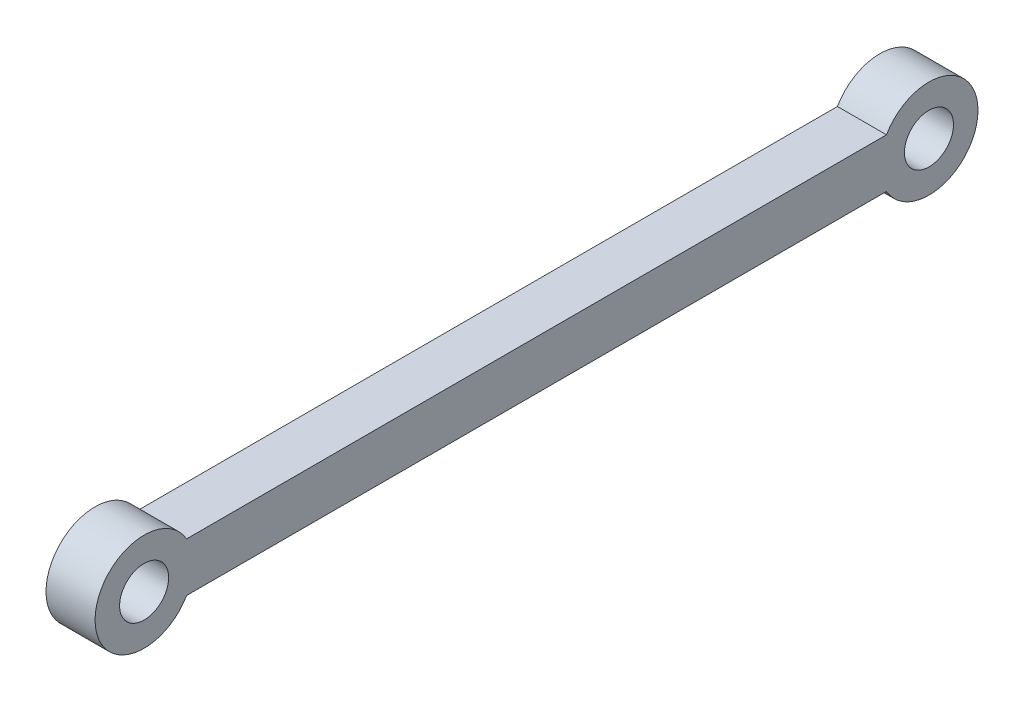
ISO-10303-21;
HEADER;
FILE_DESCRIPTION(('STEP AP214'),'2;1');
FILE_NAME('part.step','',(''),(''),'','','');
FILE_SCHEMA(('AUTOMOTIVE_DESIGN { 1 0 10303 214 1 1 1 1 }'));
ENDSEC;
DATA;
#1=APPLICATION_CONTEXT('core data for automotive mechanical design processes');
#2=APPLICATION_PROTOCOL_DEFINITION('international standard','automotive_design',2000,#1);
#3=PRODUCT_CONTEXT('',#1,'mechanical');
#4=PRODUCT('Part','Part','',(#3));
#5=PRODUCT_RELATED_PRODUCT_CATEGORY('part','',(#4));
#6=PRODUCT_DEFINITION_FORMATION('','',#4);
#7=PRODUCT_DEFINITION_CONTEXT('part definition',#1,'design');
#8=PRODUCT_DEFINITION('design','',#6,#7);
#9=PRODUCT_DEFINITION_SHAPE('','',#8);
#10=(LENGTH_UNIT() NAMED_UNIT(*) SI_UNIT(.MILLI.,.METRE.));
#11=(NAMED_UNIT(*) PLANE_ANGLE_UNIT() SI_UNIT($,.RADIAN.));
#12=(NAMED_UNIT(*) SI_UNIT($,.STERADIAN.) SOLID_ANGLE_UNIT());
#13=UNCERTAINTY_MEASURE_WITH_UNIT(LENGTH_MEASURE(1.E-05),#10,'distance_accuracy_value','');
#14=(GEOMETRIC_REPRESENTATION_CONTEXT(3) GLOBAL_UNCERTAINTY_ASSIGNED_CONTEXT((#13)) GLOBAL_UNIT_ASSIGNED_CONTEXT((#10,
#11,#12)) REPRESENTATION_CONTEXT('',''));
#15=CARTESIAN_POINT('',(0.,0.,0.));
#16=DIRECTION('',(0.,0.,1.));
#17=DIRECTION('',(1.,0.,0.));
#18=AXIS2_PLACEMENT_3D('',#15,#16,#17);
#19=CARTESIAN_POINT('',(2.5,0.,20.));
#20=DIRECTION('',(1.,0.,0.));
#21=DIRECTION('',(0.,0.,-1.));
#22=AXIS2_PLACEMENT_3D('',#19,#20,#21);
#23=PLANE('',#22);
#24=CARTESIAN_POINT('',(2.5,0.,20.));
#25=DIRECTION('',(1.,0.,0.));
#26=DIRECTION('',(0.,0.,-1.));
#27=AXIS2_PLACEMENT_3D('',#24,#25,#26);
#28=CIRCLE('',#27,1.25);
#29=CARTESIAN_POINT('',(2.5,0.,18.75));
#30=VERTEX_POINT('',#29);
#31=EDGE_CURVE('E104',#30,#30,#28,.T.);
#32=ORIENTED_EDGE('',*,*,#31,.F.);
#33=EDGE_LOOP('',(#32));
#34=FACE_BOUND('',#33,.T.);
#35=CARTESIAN_POINT('',(2.5,0.,20.));
#36=DIRECTION('',(1.,0.,0.));
#37=DIRECTION('',(0.,0.,-1.));
#38=AXIS2_PLACEMENT_3D('',#35,#36,#37);
#39=CIRCLE('',#38,2.5);
#40=CARTESIAN_POINT('',(2.5,1.25,17.8349364905389));
#41=VERTEX_POINT('',#40);
#42=CARTESIAN_POINT('',(2.5,-1.25,17.8349364905389));
#43=VERTEX_POINT('',#42);
#44=EDGE_CURVE('E89',#41,#43,#39,.T.);
#45=ORIENTED_EDGE('',*,*,#44,.T.);
#46=DIRECTION('',(0.,0.,-1.));
#47=VECTOR('',#46,1.);
#48=CARTESIAN_POINT('',(2.5,-1.25,17.8349364905389));
#49=LINE('',#48,#47);
#50=CARTESIAN_POINT('',(2.5,-1.25,-17.8349364905389));
#51=VERTEX_POINT('',#50);
#52=EDGE_CURVE('E84',#43,#51,#49,.T.);
#53=ORIENTED_EDGE('',*,*,#52,.T.);
#54=CARTESIAN_POINT('',(2.5,0.,-20.));
#55=DIRECTION('',(1.,0.,0.));
#56=DIRECTION('',(0.,0.,-1.));
#57=AXIS2_PLACEMENT_3D('',#54,#55,#56);
#58=CIRCLE('',#57,2.5);
#59=CARTESIAN_POINT('',(2.5,1.25,-17.8349364905389));
#60=VERTEX_POINT('',#59);
#61=EDGE_CURVE('E87',#51,#60,#58,.T.);
#62=ORIENTED_EDGE('',*,*,#61,.T.);
#63=DIRECTION('',(0.,0.,1.));
#64=VECTOR('',#63,1.);
#65=CARTESIAN_POINT('',(2.5,1.25,17.8349364905389));
#66=LINE('',#65,#64);
#67=EDGE_CURVE('E54',#60,#41,#66,.T.);
#68=ORIENTED_EDGE('',*,*,#67,.T.);
#69=EDGE_LOOP('',(#45,#53,#62,#68));
#70=FACE_BOUND('',#69,.T.);
#71=CARTESIAN_POINT('',(2.5,0.,-20.));
#72=DIRECTION('',(1.,0.,0.));
#73=DIRECTION('',(0.,0.,-1.));
#74=AXIS2_PLACEMENT_3D('',#71,#72,#73);
#75=CIRCLE('',#74,1.25);
#76=CARTESIAN_POINT('',(2.5,0.,-21.25));
#77=VERTEX_POINT('',#76);
#78=EDGE_CURVE('E119',#77,#77,#75,.T.);
#79=ORIENTED_EDGE('',*,*,#78,.F.);
#80=EDGE_LOOP('',(#79));
#81=FACE_BOUND('',#80,.T.);
#82=ADVANCED_FACE('F37',(#34,#70,#81),#23,.T.);
#83=CARTESIAN_POINT('',(0.,0.,20.));
#84=DIRECTION('',(1.,0.,0.));
#85=DIRECTION('',(0.,0.,-1.));
#86=AXIS2_PLACEMENT_3D('',#83,#84,#85);
#87=PLANE('',#86);
#88=CARTESIAN_POINT('',(0.,0.,20.));
#89=DIRECTION('',(1.,0.,0.));
#90=DIRECTION('',(0.,0.,-1.));
#91=AXIS2_PLACEMENT_3D('',#88,#89,#90);
#92=CIRCLE('',#91,2.5);
#93=CARTESIAN_POINT('',(0.,1.25,17.8349364905389));
#94=VERTEX_POINT('',#93);
#95=CARTESIAN_POINT('',(0.,-1.25,17.8349364905389));
#96=VERTEX_POINT('',#95);
#97=EDGE_CURVE('E101',#94,#96,#92,.T.);
#98=ORIENTED_EDGE('',*,*,#97,.F.);
#99=DIRECTION('',(0.,0.,1.));
#100=VECTOR('',#99,1.);
#101=CARTESIAN_POINT('',(0.,1.25,17.8349364905389));
#102=LINE('',#101,#100);
#103=CARTESIAN_POINT('',(0.,1.25,-17.8349364905389));
#104=VERTEX_POINT('',#103);
#105=EDGE_CURVE('E77',#104,#94,#102,.T.);
#106=ORIENTED_EDGE('',*,*,#105,.F.);
#107=CARTESIAN_POINT('',(0.,0.,-20.));
#108=DIRECTION('',(1.,0.,0.));
#109=DIRECTION('',(0.,0.,-1.));
#110=AXIS2_PLACEMENT_3D('',#107,#108,#109);
#111=CIRCLE('',#110,2.5);
#112=CARTESIAN_POINT('',(0.,-1.25,-17.8349364905389));
#113=VERTEX_POINT('',#112);
#114=EDGE_CURVE('E71',#113,#104,#111,.T.);
#115=ORIENTED_EDGE('',*,*,#114,.F.);
#116=DIRECTION('',(0.,0.,-1.));
#117=VECTOR('',#116,1.);
#118=CARTESIAN_POINT('',(0.,-1.25,17.8349364905389));
#119=LINE('',#118,#117);
#120=EDGE_CURVE('E93',#96,#113,#119,.T.);
#121=ORIENTED_EDGE('',*,*,#120,.F.);
#122=EDGE_LOOP('',(#98,#106,#115,#121));
#123=FACE_BOUND('',#122,.T.);
#124=CARTESIAN_POINT('',(0.,0.,20.));
#125=DIRECTION('',(1.,0.,0.));
#126=DIRECTION('',(0.,0.,-1.));
#127=AXIS2_PLACEMENT_3D('',#124,#125,#126);
#128=CIRCLE('',#127,1.25);
#129=CARTESIAN_POINT('',(0.,0.,18.75));
#130=VERTEX_POINT('',#129);
#131=EDGE_CURVE('E116',#130,#130,#128,.T.);
#132=ORIENTED_EDGE('',*,*,#131,.T.);
#133=EDGE_LOOP('',(#132));
#134=FACE_BOUND('',#133,.T.);
#135=CARTESIAN_POINT('',(0.,0.,-20.));
#136=DIRECTION('',(1.,0.,0.));
#137=DIRECTION('',(0.,0.,-1.));
#138=AXIS2_PLACEMENT_3D('',#135,#136,#137);
#139=CIRCLE('',#138,1.25);
#140=CARTESIAN_POINT('',(0.,0.,-21.25));
#141=VERTEX_POINT('',#140);
#142=EDGE_CURVE('E122',#141,#141,#139,.T.);
#143=ORIENTED_EDGE('',*,*,#142,.T.);
#144=EDGE_LOOP('',(#143));
#145=FACE_BOUND('',#144,.T.);
#146=ADVANCED_FACE('F112',(#123,#134,#145),#87,.F.);
#147=CARTESIAN_POINT('',(2.5,0.,20.));
#148=DIRECTION('',(-1.,0.,0.));
#149=DIRECTION('',(0.,0.,1.));
#150=AXIS2_PLACEMENT_3D('',#147,#148,#149);
#151=CYLINDRICAL_SURFACE('',#150,2.5);
#152=ORIENTED_EDGE('',*,*,#97,.T.);
#153=DIRECTION('',(-1.,0.,0.));
#154=VECTOR('',#153,1.);
#155=CARTESIAN_POINT('',(2.5,-1.25,17.8349364905389));
#156=LINE('',#155,#154);
#157=EDGE_CURVE('E11',#43,#96,#156,.T.);
#158=ORIENTED_EDGE('',*,*,#157,.F.);
#159=ORIENTED_EDGE('',*,*,#44,.F.);
#160=DIRECTION('',(-1.,0.,0.));
#161=VECTOR('',#160,1.);
#162=CARTESIAN_POINT('',(2.5,1.25,17.8349364905389));
#163=LINE('',#162,#161);
#164=EDGE_CURVE('E97',#41,#94,#163,.T.);
#165=ORIENTED_EDGE('',*,*,#164,.T.);
#166=EDGE_LOOP('',(#152,#158,#159,#165));
#167=FACE_BOUND('',#166,.T.);
#168=ADVANCED_FACE('F39',(#167),#151,.T.);
#169=CARTESIAN_POINT('',(2.5,-1.25,17.8349364905389));
#170=DIRECTION('',(0.,1.,0.));
#171=DIRECTION('',(0.,0.,1.));
#172=AXIS2_PLACEMENT_3D('',#169,#170,#171);
#173=PLANE('',#172);
#174=ORIENTED_EDGE('',*,*,#120,.T.);
#175=DIRECTION('',(-1.,0.,0.));
#176=VECTOR('',#175,1.);
#177=CARTESIAN_POINT('',(2.5,-1.25,-17.8349364905389));
#178=LINE('',#177,#176);
#179=EDGE_CURVE('E46',#51,#113,#178,.T.);
#180=ORIENTED_EDGE('',*,*,#179,.F.);
#181=ORIENTED_EDGE('',*,*,#52,.F.);
#182=ORIENTED_EDGE('',*,*,#157,.T.);
#183=EDGE_LOOP('',(#174,#180,#181,#182));
#184=FACE_BOUND('',#183,.T.);
#185=ADVANCED_FACE('F92',(#184),#173,.F.);
#186=CARTESIAN_POINT('',(2.5,0.,-20.));
#187=DIRECTION('',(-1.,0.,0.));
#188=DIRECTION('',(0.,0.,1.));
#189=AXIS2_PLACEMENT_3D('',#186,#187,#188);
#190=CYLINDRICAL_SURFACE('',#189,2.5);
#191=ORIENTED_EDGE('',*,*,#114,.T.);
#192=DIRECTION('',(-1.,0.,0.));
#193=VECTOR('',#192,1.);
#194=CARTESIAN_POINT('',(2.5,1.25,-17.8349364905389));
#195=LINE('',#194,#193);
#196=EDGE_CURVE('E94',#60,#104,#195,.T.);
#197=ORIENTED_EDGE('',*,*,#196,.F.);
#198=ORIENTED_EDGE('',*,*,#61,.F.);
#199=ORIENTED_EDGE('',*,*,#179,.T.);
#200=EDGE_LOOP('',(#191,#197,#198,#199));
#201=FACE_BOUND('',#200,.T.);
#202=ADVANCED_FACE('F95',(#201),#190,.T.);
#203=CARTESIAN_POINT('',(2.5,1.25,17.8349364905389));
#204=DIRECTION('',(0.,-1.,0.));
#205=DIRECTION('',(0.,0.,-1.));
#206=AXIS2_PLACEMENT_3D('',#203,#204,#205);
#207=PLANE('',#206);
#208=ORIENTED_EDGE('',*,*,#105,.T.);
#209=ORIENTED_EDGE('',*,*,#164,.F.);
#210=ORIENTED_EDGE('',*,*,#67,.F.);
#211=ORIENTED_EDGE('',*,*,#196,.T.);
#212=EDGE_LOOP('',(#208,#209,#210,#211));
#213=FACE_BOUND('',#212,.T.);
#214=ADVANCED_FACE('F109',(#213),#207,.F.);
#215=CARTESIAN_POINT('',(2.5,0.,20.));
#216=DIRECTION('',(-1.,0.,0.));
#217=DIRECTION('',(0.,0.,1.));
#218=AXIS2_PLACEMENT_3D('',#215,#216,#217);
#219=CYLINDRICAL_SURFACE('',#218,1.25);
#220=ORIENTED_EDGE('',*,*,#31,.T.);
#221=EDGE_LOOP('',(#220));
#222=FACE_BOUND('',#221,.T.);
#223=ORIENTED_EDGE('',*,*,#131,.F.);
#224=EDGE_LOOP('',(#223));
#225=FACE_BOUND('',#224,.T.);
#226=ADVANCED_FACE('F139',(#222,#225),#219,.F.);
#227=CARTESIAN_POINT('',(2.5,0.,-20.));
#228=DIRECTION('',(-1.,0.,0.));
#229=DIRECTION('',(0.,0.,1.));
#230=AXIS2_PLACEMENT_3D('',#227,#228,#229);
#231=CYLINDRICAL_SURFACE('',#230,1.25);
#232=ORIENTED_EDGE('',*,*,#78,.T.);
#233=EDGE_LOOP('',(#232));
#234=FACE_BOUND('',#233,.T.);
#235=ORIENTED_EDGE('',*,*,#142,.F.);
#236=EDGE_LOOP('',(#235));
#237=FACE_BOUND('',#236,.T.);
#238=ADVANCED_FACE('F128',(#234,#237),#231,.F.);
#239=CLOSED_SHELL('',(#82,#146,#168,#185,#202,#214,#226,#238));
#240=MANIFOLD_SOLID_BREP('B2',#239);
#241=ADVANCED_BREP_SHAPE_REPRESENTATION('',(#18,#240),#14);
#242=SHAPE_DEFINITION_REPRESENTATION(#9,#241);
ENDSEC;
END-ISO-10303-21;
